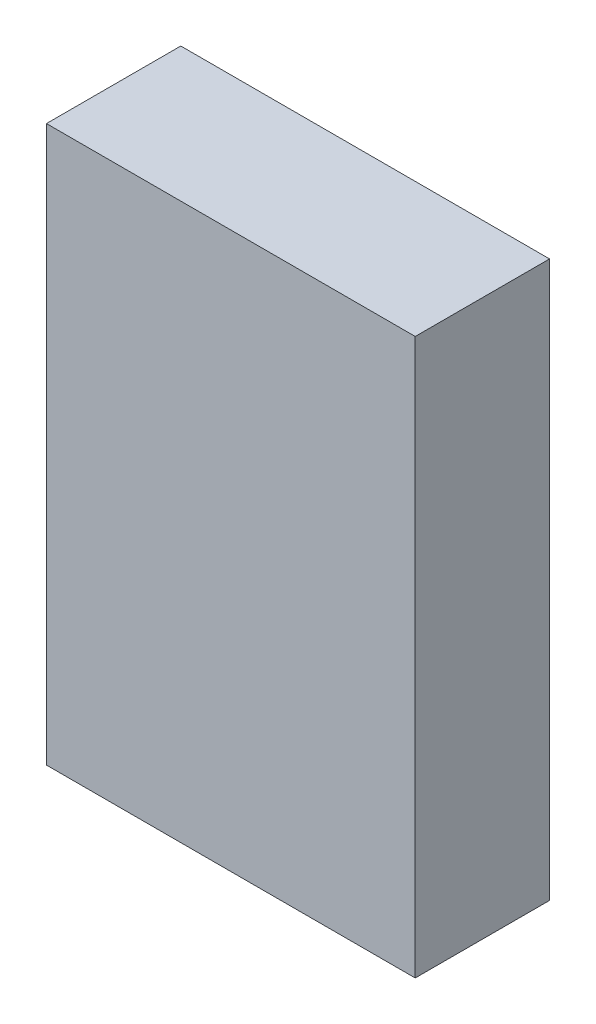
ISO-10303-21;
HEADER;
FILE_DESCRIPTION(('STEP AP214'),'2;1');
FILE_NAME('part.step','',(''),(''),'','','');
FILE_SCHEMA(('AUTOMOTIVE_DESIGN { 1 0 10303 214 1 1 1 1 }'));
ENDSEC;
DATA;
#1=APPLICATION_CONTEXT('core data for automotive mechanical design processes');
#2=APPLICATION_PROTOCOL_DEFINITION('international standard','automotive_design',2000,#1);
#3=PRODUCT_CONTEXT('',#1,'mechanical');
#4=PRODUCT('Part','Part','',(#3));
#5=PRODUCT_RELATED_PRODUCT_CATEGORY('part','',(#4));
#6=PRODUCT_DEFINITION_FORMATION('','',#4);
#7=PRODUCT_DEFINITION_CONTEXT('part definition',#1,'design');
#8=PRODUCT_DEFINITION('design','',#6,#7);
#9=PRODUCT_DEFINITION_SHAPE('','',#8);
#10=(LENGTH_UNIT() NAMED_UNIT(*) SI_UNIT(.MILLI.,.METRE.));
#11=(NAMED_UNIT(*) PLANE_ANGLE_UNIT() SI_UNIT($,.RADIAN.));
#12=(NAMED_UNIT(*) SI_UNIT($,.STERADIAN.) SOLID_ANGLE_UNIT());
#13=UNCERTAINTY_MEASURE_WITH_UNIT(LENGTH_MEASURE(1.E-05),#10,'distance_accuracy_value','');
#14=(GEOMETRIC_REPRESENTATION_CONTEXT(3) GLOBAL_UNCERTAINTY_ASSIGNED_CONTEXT((#13)) GLOBAL_UNIT_ASSIGNED_CONTEXT((#10,
#11,#12)) REPRESENTATION_CONTEXT('',''));
#15=CARTESIAN_POINT('',(0.,0.,0.));
#16=DIRECTION('',(0.,0.,1.));
#17=DIRECTION('',(1.,0.,0.));
#18=AXIS2_PLACEMENT_3D('',#15,#16,#17);
#19=CARTESIAN_POINT('',(-64.6826462110364,44.8261454850102,22.));
#20=DIRECTION('',(1.,0.,0.));
#21=DIRECTION('',(0.,0.,-1.));
#22=AXIS2_PLACEMENT_3D('',#19,#20,#21);
#23=PLANE('',#22);
#24=DIRECTION('',(0.,-1.,0.));
#25=VECTOR('',#24,1.);
#26=CARTESIAN_POINT('',(-64.6826462110364,44.8261454850102,0.));
#27=LINE('',#26,#25);
#28=CARTESIAN_POINT('',(-64.6826462110364,44.8261454850102,0.));
#29=VERTEX_POINT('',#28);
#30=CARTESIAN_POINT('',(-64.6826462110364,-46.1738545149898,0.));
#31=VERTEX_POINT('',#30);
#32=EDGE_CURVE('E96',#29,#31,#27,.T.);
#33=ORIENTED_EDGE('',*,*,#32,.T.);
#34=DIRECTION('',(0.,0.,-1.));
#35=VECTOR('',#34,1.);
#36=CARTESIAN_POINT('',(-64.6826462110364,-46.1738545149898,22.));
#37=LINE('',#36,#35);
#38=CARTESIAN_POINT('',(-64.6826462110364,-46.1738545149898,22.));
#39=VERTEX_POINT('',#38);
#40=EDGE_CURVE('E11',#39,#31,#37,.T.);
#41=ORIENTED_EDGE('',*,*,#40,.F.);
#42=DIRECTION('',(0.,-1.,0.));
#43=VECTOR('',#42,1.);
#44=CARTESIAN_POINT('',(-64.6826462110364,44.8261454850102,22.));
#45=LINE('',#44,#43);
#46=CARTESIAN_POINT('',(-64.6826462110364,44.8261454850102,22.));
#47=VERTEX_POINT('',#46);
#48=EDGE_CURVE('E84',#47,#39,#45,.T.);
#49=ORIENTED_EDGE('',*,*,#48,.F.);
#50=DIRECTION('',(0.,0.,-1.));
#51=VECTOR('',#50,1.);
#52=CARTESIAN_POINT('',(-64.6826462110364,44.8261454850102,22.));
#53=LINE('',#52,#51);
#54=EDGE_CURVE('E92',#47,#29,#53,.T.);
#55=ORIENTED_EDGE('',*,*,#54,.T.);
#56=EDGE_LOOP('',(#33,#41,#49,#55));
#57=FACE_BOUND('',#56,.T.);
#58=ADVANCED_FACE('F33',(#57),#23,.F.);
#59=CARTESIAN_POINT('',(-64.6826462110364,-46.1738545149898,22.));
#60=DIRECTION('',(0.,1.,0.));
#61=DIRECTION('',(-1.,0.,0.));
#62=AXIS2_PLACEMENT_3D('',#59,#60,#61);
#63=PLANE('',#62);
#64=DIRECTION('',(1.,0.,0.));
#65=VECTOR('',#64,1.);
#66=CARTESIAN_POINT('',(-64.6826462110364,-46.1738545149898,0.));
#67=LINE('',#66,#65);
#68=CARTESIAN_POINT('',(-4.28264621103637,-46.1738545149898,0.));
#69=VERTEX_POINT('',#68);
#70=EDGE_CURVE('E88',#31,#69,#67,.T.);
#71=ORIENTED_EDGE('',*,*,#70,.T.);
#72=DIRECTION('',(0.,0.,-1.));
#73=VECTOR('',#72,1.);
#74=CARTESIAN_POINT('',(-4.28264621103637,-46.1738545149898,22.));
#75=LINE('',#74,#73);
#76=CARTESIAN_POINT('',(-4.28264621103637,-46.1738545149898,22.));
#77=VERTEX_POINT('',#76);
#78=EDGE_CURVE('E41',#77,#69,#75,.T.);
#79=ORIENTED_EDGE('',*,*,#78,.F.);
#80=DIRECTION('',(1.,0.,0.));
#81=VECTOR('',#80,1.);
#82=CARTESIAN_POINT('',(-64.6826462110364,-46.1738545149898,22.));
#83=LINE('',#82,#81);
#84=EDGE_CURVE('E79',#39,#77,#83,.T.);
#85=ORIENTED_EDGE('',*,*,#84,.F.);
#86=ORIENTED_EDGE('',*,*,#40,.T.);
#87=EDGE_LOOP('',(#71,#79,#85,#86));
#88=FACE_BOUND('',#87,.T.);
#89=ADVANCED_FACE('F87',(#88),#63,.F.);
#90=CARTESIAN_POINT('',(-4.2826462110364,44.8261454850102,22.));
#91=DIRECTION('',(-1.,0.,0.));
#92=DIRECTION('',(0.,-1.,0.));
#93=AXIS2_PLACEMENT_3D('',#90,#91,#92);
#94=PLANE('',#93);
#95=DIRECTION('',(0.,1.,0.));
#96=VECTOR('',#95,1.);
#97=CARTESIAN_POINT('',(-4.2826462110364,44.8261454850102,0.));
#98=LINE('',#97,#96);
#99=CARTESIAN_POINT('',(-4.2826462110364,44.8261454850102,0.));
#100=VERTEX_POINT('',#99);
#101=EDGE_CURVE('E66',#69,#100,#98,.T.);
#102=ORIENTED_EDGE('',*,*,#101,.T.);
#103=DIRECTION('',(0.,0.,-1.));
#104=VECTOR('',#103,1.);
#105=CARTESIAN_POINT('',(-4.2826462110364,44.8261454850102,22.));
#106=LINE('',#105,#104);
#107=CARTESIAN_POINT('',(-4.2826462110364,44.8261454850102,22.));
#108=VERTEX_POINT('',#107);
#109=EDGE_CURVE('E89',#108,#100,#106,.T.);
#110=ORIENTED_EDGE('',*,*,#109,.F.);
#111=DIRECTION('',(0.,1.,0.));
#112=VECTOR('',#111,1.);
#113=CARTESIAN_POINT('',(-4.2826462110364,44.8261454850102,22.));
#114=LINE('',#113,#112);
#115=EDGE_CURVE('E82',#77,#108,#114,.T.);
#116=ORIENTED_EDGE('',*,*,#115,.F.);
#117=ORIENTED_EDGE('',*,*,#78,.T.);
#118=EDGE_LOOP('',(#102,#110,#116,#117));
#119=FACE_BOUND('',#118,.T.);
#120=ADVANCED_FACE('F90',(#119),#94,.F.);
#121=CARTESIAN_POINT('',(-64.6826462110364,44.8261454850102,22.));
#122=DIRECTION('',(0.,-1.,0.));
#123=DIRECTION('',(0.,0.,-1.));
#124=AXIS2_PLACEMENT_3D('',#121,#122,#123);
#125=PLANE('',#124);
#126=DIRECTION('',(-1.,0.,0.));
#127=VECTOR('',#126,1.);
#128=CARTESIAN_POINT('',(-64.6826462110364,44.8261454850102,0.));
#129=LINE('',#128,#127);
#130=EDGE_CURVE('E72',#100,#29,#129,.T.);
#131=ORIENTED_EDGE('',*,*,#130,.T.);
#132=ORIENTED_EDGE('',*,*,#54,.F.);
#133=DIRECTION('',(-1.,0.,0.));
#134=VECTOR('',#133,1.);
#135=CARTESIAN_POINT('',(-64.6826462110364,44.8261454850102,22.));
#136=LINE('',#135,#134);
#137=EDGE_CURVE('E49',#108,#47,#136,.T.);
#138=ORIENTED_EDGE('',*,*,#137,.F.);
#139=ORIENTED_EDGE('',*,*,#109,.T.);
#140=EDGE_LOOP('',(#131,#132,#138,#139));
#141=FACE_BOUND('',#140,.T.);
#142=ADVANCED_FACE('F103',(#141),#125,.F.);
#143=CARTESIAN_POINT('',(0.,0.,22.));
#144=DIRECTION('',(0.,0.,1.));
#145=DIRECTION('',(1.,0.,0.));
#146=AXIS2_PLACEMENT_3D('',#143,#144,#145);
#147=PLANE('',#146);
#148=ORIENTED_EDGE('',*,*,#48,.T.);
#149=ORIENTED_EDGE('',*,*,#84,.T.);
#150=ORIENTED_EDGE('',*,*,#115,.T.);
#151=ORIENTED_EDGE('',*,*,#137,.T.);
#152=EDGE_LOOP('',(#148,#149,#150,#151));
#153=FACE_BOUND('',#152,.T.);
#154=ADVANCED_FACE('F80',(#153),#147,.T.);
#155=CARTESIAN_POINT('',(0.,0.,0.));
#156=DIRECTION('',(0.,0.,1.));
#157=DIRECTION('',(1.,0.,0.));
#158=AXIS2_PLACEMENT_3D('',#155,#156,#157);
#159=PLANE('',#158);
#160=ORIENTED_EDGE('',*,*,#32,.F.);
#161=ORIENTED_EDGE('',*,*,#130,.F.);
#162=ORIENTED_EDGE('',*,*,#101,.F.);
#163=ORIENTED_EDGE('',*,*,#70,.F.);
#164=EDGE_LOOP('',(#160,#161,#162,#163));
#165=FACE_BOUND('',#164,.T.);
#166=ADVANCED_FACE('F106',(#165),#159,.F.);
#167=CLOSED_SHELL('',(#58,#89,#120,#142,#154,#166));
#168=MANIFOLD_SOLID_BREP('B2',#167);
#169=ADVANCED_BREP_SHAPE_REPRESENTATION('',(#18,#168),#14);
#170=SHAPE_DEFINITION_REPRESENTATION(#9,#169);
ENDSEC;
END-ISO-10303-21;
